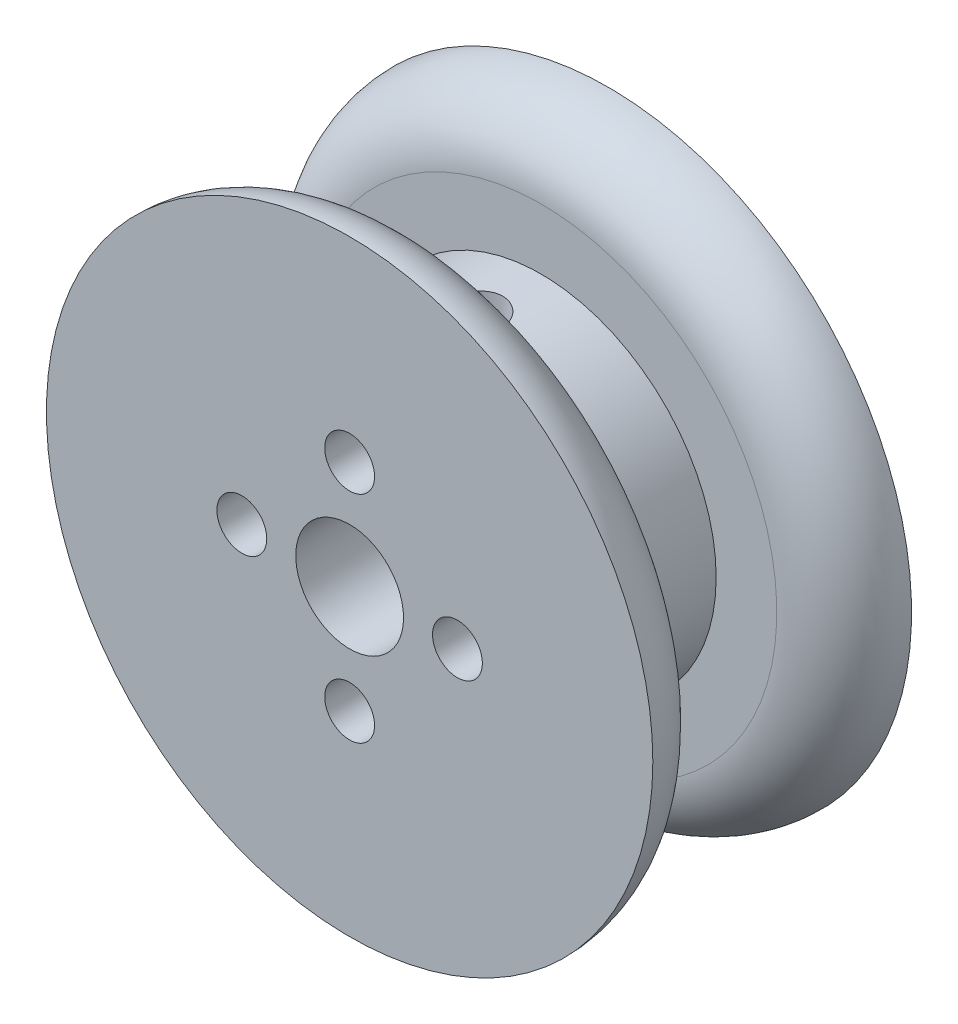
ISO-10303-21;
HEADER;
FILE_DESCRIPTION(('STEP AP214'),'2;1');
FILE_NAME('part.step','',(''),(''),'','','');
FILE_SCHEMA(('AUTOMOTIVE_DESIGN { 1 0 10303 214 1 1 1 1 }'));
ENDSEC;
DATA;
#1=APPLICATION_CONTEXT('core data for automotive mechanical design processes');
#2=APPLICATION_PROTOCOL_DEFINITION('international standard','automotive_design',2000,#1);
#3=PRODUCT_CONTEXT('',#1,'mechanical');
#4=PRODUCT('Part','Part','',(#3));
#5=PRODUCT_RELATED_PRODUCT_CATEGORY('part','',(#4));
#6=PRODUCT_DEFINITION_FORMATION('','',#4);
#7=PRODUCT_DEFINITION_CONTEXT('part definition',#1,'design');
#8=PRODUCT_DEFINITION('design','',#6,#7);
#9=PRODUCT_DEFINITION_SHAPE('','',#8);
#10=(LENGTH_UNIT() NAMED_UNIT(*) SI_UNIT(.MILLI.,.METRE.));
#11=(NAMED_UNIT(*) PLANE_ANGLE_UNIT() SI_UNIT($,.RADIAN.));
#12=(NAMED_UNIT(*) SI_UNIT($,.STERADIAN.) SOLID_ANGLE_UNIT());
#13=UNCERTAINTY_MEASURE_WITH_UNIT(LENGTH_MEASURE(1.E-05),#10,'distance_accuracy_value','');
#14=(GEOMETRIC_REPRESENTATION_CONTEXT(3) GLOBAL_UNCERTAINTY_ASSIGNED_CONTEXT((#13)) GLOBAL_UNIT_ASSIGNED_CONTEXT((#10,
#11,#12)) REPRESENTATION_CONTEXT('',''));
#15=CARTESIAN_POINT('',(0.,0.,0.));
#16=DIRECTION('',(0.,0.,1.));
#17=DIRECTION('',(1.,0.,0.));
#18=AXIS2_PLACEMENT_3D('',#15,#16,#17);
#19=CARTESIAN_POINT('',(0.,0.,-9.2));
#20=DIRECTION('',(0.,0.,1.));
#21=DIRECTION('',(1.,0.,0.));
#22=AXIS2_PLACEMENT_3D('',#19,#20,#21);
#23=CYLINDRICAL_SURFACE('',#22,13.);
#24=CARTESIAN_POINT('',(0.,-13.,-6.35));
#25=CARTESIAN_POINT('',(-0.103355224271389,-12.9999984046274,-6.34999569258269));
#26=CARTESIAN_POINT('',(-0.206771932129645,-12.998754476353,-6.34130944450442));
#27=CARTESIAN_POINT('',(-0.410718914534138,-12.9939118953438,-6.30680035180995));
#28=CARTESIAN_POINT('',(-0.511246207774866,-12.9903108956267,-6.28096042657621));
#29=CARTESIAN_POINT('',(-0.706432981710829,-12.9811591704458,-6.21292815236832));
#30=CARTESIAN_POINT('',(-0.801096681662608,-12.9756098665528,-6.17074772385023));
#31=CARTESIAN_POINT('',(-0.981986644509899,-12.9631760311847,-6.07125996451536));
#32=CARTESIAN_POINT('',(-1.06821416597394,-12.9562916993368,-6.01395489483037));
#33=CARTESIAN_POINT('',(-1.23040853191058,-12.9419000153636,-5.88541298593724));
#34=CARTESIAN_POINT('',(-1.30630718719231,-12.9343890055644,-5.8140905060376));
#35=CARTESIAN_POINT('',(-1.44510133911553,-12.9196194096118,-5.6597225672235));
#36=CARTESIAN_POINT('',(-1.50799611688199,-12.912360837432,-5.57667646063514));
#37=CARTESIAN_POINT('',(-1.61925905777618,-12.8988823569092,-5.40076513727148));
#38=CARTESIAN_POINT('',(-1.66756189810424,-12.8926671729623,-5.30785821086944));
#39=CARTESIAN_POINT('',(-1.74785247502596,-12.8820286482007,-5.11514729156198));
#40=CARTESIAN_POINT('',(-1.77984101151242,-12.8776052195382,-5.01534363707669));
#41=CARTESIAN_POINT('',(-1.8263845790242,-12.8710867266194,-4.8123866865606));
#42=CARTESIAN_POINT('',(-1.84105587566176,-12.868976141184,-4.70926056087973));
#43=CARTESIAN_POINT('',(-1.8529085459522,-12.8672750791784,-4.50199012423284));
#44=CARTESIAN_POINT('',(-1.85009082502002,-12.8676844721477,-4.39784586625472));
#45=CARTESIAN_POINT('',(-1.82714059605557,-12.8709629116664,-4.19231312051322));
#46=CARTESIAN_POINT('',(-1.80713711148445,-12.8738136292716,-4.0909098914198));
#47=CARTESIAN_POINT('',(-1.75058493681048,-12.8816249001714,-3.89291402781469));
#48=CARTESIAN_POINT('',(-1.714035821672,-12.886585507666,-3.79632151695482));
#49=CARTESIAN_POINT('',(-1.62529423001724,-12.8980780495524,-3.61029373882433));
#50=CARTESIAN_POINT('',(-1.57304664142565,-12.904615503508,-3.52088511683329));
#51=CARTESIAN_POINT('',(-1.45443052492482,-12.9185210606999,-3.35205540882575));
#52=CARTESIAN_POINT('',(-1.38806116167038,-12.9258892130622,-3.27263491407922));
#53=CARTESIAN_POINT('',(-1.24237501782575,-12.9407071171165,-3.12528777130375));
#54=CARTESIAN_POINT('',(-1.16294721335573,-12.9481570069325,-3.05747086136962));
#55=CARTESIAN_POINT('',(-0.993778506199191,-12.9622373199542,-2.93611363663936));
#56=CARTESIAN_POINT('',(-0.904037566132221,-12.9688677401896,-2.88257337359196));
#57=CARTESIAN_POINT('',(-0.716698313307467,-12.9805679993537,-2.79128543714122));
#58=CARTESIAN_POINT('',(-0.619096076962137,-12.9856370528363,-2.75354570878564));
#59=CARTESIAN_POINT('',(-0.418851174555621,-12.993636715029,-2.69502281880031));
#60=CARTESIAN_POINT('',(-0.316208815309098,-12.9965674537361,-2.67423862636513));
#61=CARTESIAN_POINT('',(-0.1097449840378,-12.9999431618151,-2.65036150932744));
#62=CARTESIAN_POINT('',(-0.00594130452324945,-13.0004093422212,-2.64711761989507));
#63=CARTESIAN_POINT('',(0.200728418740313,-12.9988609933125,-2.6580132376098));
#64=CARTESIAN_POINT('',(0.30359448845751,-12.9968465329135,-2.67215226183424));
#65=CARTESIAN_POINT('',(0.505015586085533,-12.9905763842772,-2.71728684856182));
#66=CARTESIAN_POINT('',(0.603587308770494,-12.9863304096685,-2.74820937258464));
#67=CARTESIAN_POINT('',(0.794146799332252,-12.9760720093274,-2.82595651538533));
#68=CARTESIAN_POINT('',(0.886134284961675,-12.9700595079255,-2.87278181537592));
#69=CARTESIAN_POINT('',(1.06158135313579,-12.9568840887436,-2.98136309360068));
#70=CARTESIAN_POINT('',(1.14498072656383,-12.9497138491383,-3.04321545409135));
#71=CARTESIAN_POINT('',(1.30026906989386,-12.9350452464949,-3.17996020270059));
#72=CARTESIAN_POINT('',(1.37215744056912,-12.9275468664008,-3.25485326925409));
#73=CARTESIAN_POINT('',(1.50292799609361,-12.913000421722,-3.41622330759965));
#74=CARTESIAN_POINT('',(1.56170934184532,-12.9059561262914,-3.50278238780377));
#75=CARTESIAN_POINT('',(1.66389774630913,-12.8931806601191,-3.6846341209078));
#76=CARTESIAN_POINT('',(1.70730518696191,-12.8874494567568,-3.77992655676706));
#77=CARTESIAN_POINT('',(1.77735502211296,-12.8779758877502,-3.97623127185951));
#78=CARTESIAN_POINT('',(1.80405171509974,-12.8742270868826,-4.07722385098156));
#79=CARTESIAN_POINT('',(1.84009576791879,-12.869125242328,-4.28231606268207));
#80=CARTESIAN_POINT('',(1.84944419639189,-12.8677720510735,-4.38641550347864));
#81=CARTESIAN_POINT('',(1.85050282189108,-12.8676197680126,-4.5937620199445));
#82=CARTESIAN_POINT('',(1.84237151885147,-12.8687977246238,-4.69700830475682));
#83=CARTESIAN_POINT('',(1.80903984516754,-12.8735253071112,-4.90064966659109));
#84=CARTESIAN_POINT('',(1.78383949140961,-12.8770749306411,-5.00104474643364));
#85=CARTESIAN_POINT('',(1.71713904046029,-12.88613817119,-5.19609740143244));
#86=CARTESIAN_POINT('',(1.67564891001854,-12.891650587101,-5.29075844410508));
#87=CARTESIAN_POINT('',(1.57756230416439,-12.9040199180505,-5.47180128423756));
#88=CARTESIAN_POINT('',(1.52096542108712,-12.9108768693706,-5.5581828581854));
#89=CARTESIAN_POINT('',(1.39369188288622,-12.9252368652281,-5.72102173909339));
#90=CARTESIAN_POINT('',(1.32289755317461,-12.9327449902197,-5.7973866338817));
#91=CARTESIAN_POINT('',(1.16948699317133,-12.9475181318469,-5.93721009565139));
#92=CARTESIAN_POINT('',(1.08686800768751,-12.9547830913358,-6.00066564633662));
#93=CARTESIAN_POINT('',(0.911677065314903,-12.9682919136744,-6.11314518363868));
#94=CARTESIAN_POINT('',(0.819058031069487,-12.9745305638802,-6.16209645193412));
#95=CARTESIAN_POINT('',(0.626870666287216,-12.9852323449838,-6.24367662304838));
#96=CARTESIAN_POINT('',(0.527309775880254,-12.9896973434759,-6.27632270404353));
#97=CARTESIAN_POINT('',(0.356065796509366,-12.9953107215786,-6.31682522588064));
#98=CARTESIAN_POINT('',(0.285447719902959,-12.9970603230679,-6.32924712968869));
#99=CARTESIAN_POINT('',(0.143229598916134,-12.9994055089737,-6.34583596547163));
#100=CARTESIAN_POINT('',(0.0716295649853334,-13.0000011056611,-6.35000298522334));
#101=CARTESIAN_POINT('',(0.,-13.,-6.35));
#102=B_SPLINE_CURVE_WITH_KNOTS('',3,(#24,#25,#26,#27,#28,#29,#30,#31,#32,#33,#34,#35,#36,#37,
#38,#39,#40,#41,#42,#43,#44,#45,#46,#47,#48,#49,#50,#51,#52,#53,#54,#55,#56,#57,#58,#59,#60,#61,
#62,#63,#64,#65,#66,#67,#68,#69,#70,#71,#72,#73,#74,#75,#76,#77,#78,#79,#80,#81,#82,#83,#84,#85,
#86,#87,#88,#89,#90,#91,#92,#93,#94,#95,#96,#97,#98,#99,#100,#101),.UNSPECIFIED.,.T.,.F.,(4,2,2,
2,2,2,2,2,2,2,2,2,2,2,2,2,2,2,2,2,2,2,2,2,2,2,2,2,2,2,2,2,2,2,2,2,2,2,4),(0.,0.309803964847356,
0.619916877811146,0.929803987008506,1.23964479434159,1.55144099954288,1.86325443672845,
2.17644374122449,2.48961768852473,2.80067684725193,3.11171990242956,3.42044798235276,
3.72918399354696,4.03901679530543,4.34886792969821,4.66150437737796,4.97414195825925,
5.28693655571911,5.59971213553144,5.90979140112807,6.21986205246585,6.52859403195998,
6.83733923799311,7.14811956286881,7.45891606073841,7.77202695547842,8.08513007092096,
8.39721046118444,8.70927162687812,9.01851507703499,9.32775822125848,9.63681245203345,
9.94587502366722,10.2576138006398,10.5694253326066,10.8827746841559,11.1957932093905,
11.4105028126858,11.6252101328932),.UNSPECIFIED.);
#103=CARTESIAN_POINT('',(0.,-13.,-6.35));
#104=VERTEX_POINT('',#103);
#105=EDGE_CURVE('E130',#104,#104,#102,.T.);
#106=ORIENTED_EDGE('',*,*,#105,.T.);
#107=EDGE_LOOP('',(#106));
#108=FACE_BOUND('',#107,.T.);
#109=CARTESIAN_POINT('',(0.,0.,-9.2));
#110=DIRECTION('',(0.,0.,1.));
#111=DIRECTION('',(1.,0.,0.));
#112=AXIS2_PLACEMENT_3D('',#109,#110,#111);
#113=CIRCLE('',#112,13.);
#114=CARTESIAN_POINT('',(13.,0.,-9.2));
#115=VERTEX_POINT('',#114);
#116=EDGE_CURVE('E87',#115,#115,#113,.T.);
#117=ORIENTED_EDGE('',*,*,#116,.T.);
#118=EDGE_LOOP('',(#117));
#119=FACE_BOUND('',#118,.T.);
#120=CARTESIAN_POINT('',(0.,0.,0.));
#121=DIRECTION('',(0.,0.,1.));
#122=DIRECTION('',(1.,0.,0.));
#123=AXIS2_PLACEMENT_3D('',#120,#121,#122);
#124=CIRCLE('',#123,13.);
#125=CARTESIAN_POINT('',(13.,0.,0.));
#126=VERTEX_POINT('',#125);
#127=EDGE_CURVE('E84',#126,#126,#124,.T.);
#128=ORIENTED_EDGE('',*,*,#127,.F.);
#129=EDGE_LOOP('',(#128));
#130=FACE_BOUND('',#129,.T.);
#131=CARTESIAN_POINT('',(0.,13.,-6.35));
#132=CARTESIAN_POINT('',(0.103355224271389,12.9999984046274,-6.34999569258269));
#133=CARTESIAN_POINT('',(0.206771932129645,12.998754476353,-6.34130944450442));
#134=CARTESIAN_POINT('',(0.410718914534138,12.9939118953438,-6.30680035180995));
#135=CARTESIAN_POINT('',(0.511246207774866,12.9903108956267,-6.28096042657621));
#136=CARTESIAN_POINT('',(0.706432981710829,12.9811591704458,-6.21292815236832));
#137=CARTESIAN_POINT('',(0.801096681662608,12.9756098665528,-6.17074772385023));
#138=CARTESIAN_POINT('',(0.981986644509899,12.9631760311847,-6.07125996451536));
#139=CARTESIAN_POINT('',(1.06821416597394,12.9562916993368,-6.01395489483037));
#140=CARTESIAN_POINT('',(1.23040853191058,12.9419000153636,-5.88541298593724));
#141=CARTESIAN_POINT('',(1.30630718719231,12.9343890055644,-5.8140905060376));
#142=CARTESIAN_POINT('',(1.44510133911553,12.9196194096118,-5.6597225672235));
#143=CARTESIAN_POINT('',(1.50799611688199,12.912360837432,-5.57667646063514));
#144=CARTESIAN_POINT('',(1.61925905777618,12.8988823569092,-5.40076513727148));
#145=CARTESIAN_POINT('',(1.66756189810424,12.8926671729623,-5.30785821086944));
#146=CARTESIAN_POINT('',(1.74785247502596,12.8820286482007,-5.11514729156198));
#147=CARTESIAN_POINT('',(1.77984101151242,12.8776052195382,-5.01534363707669));
#148=CARTESIAN_POINT('',(1.8263845790242,12.8710867266194,-4.8123866865606));
#149=CARTESIAN_POINT('',(1.84105587566176,12.868976141184,-4.70926056087973));
#150=CARTESIAN_POINT('',(1.8529085459522,12.8672750791784,-4.50199012423284));
#151=CARTESIAN_POINT('',(1.85009082502002,12.8676844721477,-4.39784586625472));
#152=CARTESIAN_POINT('',(1.82714059605557,12.8709629116664,-4.19231312051322));
#153=CARTESIAN_POINT('',(1.80713711148445,12.8738136292716,-4.0909098914198));
#154=CARTESIAN_POINT('',(1.75058493681048,12.8816249001714,-3.89291402781469));
#155=CARTESIAN_POINT('',(1.714035821672,12.886585507666,-3.79632151695482));
#156=CARTESIAN_POINT('',(1.62529423001724,12.8980780495524,-3.61029373882433));
#157=CARTESIAN_POINT('',(1.57304664142565,12.904615503508,-3.52088511683329));
#158=CARTESIAN_POINT('',(1.45443052492482,12.9185210606999,-3.35205540882575));
#159=CARTESIAN_POINT('',(1.38806116167038,12.9258892130622,-3.27263491407922));
#160=CARTESIAN_POINT('',(1.24237501782575,12.9407071171165,-3.12528777130375));
#161=CARTESIAN_POINT('',(1.16294721335573,12.9481570069325,-3.05747086136962));
#162=CARTESIAN_POINT('',(0.993778506199191,12.9622373199542,-2.93611363663936));
#163=CARTESIAN_POINT('',(0.904037566132221,12.9688677401896,-2.88257337359196));
#164=CARTESIAN_POINT('',(0.716698313307467,12.9805679993537,-2.79128543714122));
#165=CARTESIAN_POINT('',(0.619096076962137,12.9856370528363,-2.75354570878564));
#166=CARTESIAN_POINT('',(0.418851174555621,12.993636715029,-2.69502281880031));
#167=CARTESIAN_POINT('',(0.316208815309098,12.9965674537361,-2.67423862636513));
#168=CARTESIAN_POINT('',(0.1097449840378,12.9999431618151,-2.65036150932744));
#169=CARTESIAN_POINT('',(0.00594130452324945,13.0004093422212,-2.64711761989507));
#170=CARTESIAN_POINT('',(-0.200728418740313,12.9988609933125,-2.6580132376098));
#171=CARTESIAN_POINT('',(-0.30359448845751,12.9968465329135,-2.67215226183424));
#172=CARTESIAN_POINT('',(-0.505015586085533,12.9905763842772,-2.71728684856182));
#173=CARTESIAN_POINT('',(-0.603587308770494,12.9863304096685,-2.74820937258464));
#174=CARTESIAN_POINT('',(-0.794146799332252,12.9760720093274,-2.82595651538533));
#175=CARTESIAN_POINT('',(-0.886134284961675,12.9700595079255,-2.87278181537592));
#176=CARTESIAN_POINT('',(-1.06158135313579,12.9568840887436,-2.98136309360068));
#177=CARTESIAN_POINT('',(-1.14498072656383,12.9497138491383,-3.04321545409135));
#178=CARTESIAN_POINT('',(-1.30026906989386,12.9350452464949,-3.17996020270059));
#179=CARTESIAN_POINT('',(-1.37215744056912,12.9275468664008,-3.25485326925409));
#180=CARTESIAN_POINT('',(-1.50292799609361,12.913000421722,-3.41622330759965));
#181=CARTESIAN_POINT('',(-1.56170934184532,12.9059561262914,-3.50278238780377));
#182=CARTESIAN_POINT('',(-1.66389774630913,12.8931806601191,-3.6846341209078));
#183=CARTESIAN_POINT('',(-1.70730518696191,12.8874494567568,-3.77992655676706));
#184=CARTESIAN_POINT('',(-1.77735502211296,12.8779758877502,-3.97623127185951));
#185=CARTESIAN_POINT('',(-1.80405171509974,12.8742270868826,-4.07722385098156));
#186=CARTESIAN_POINT('',(-1.84009576791879,12.869125242328,-4.28231606268207));
#187=CARTESIAN_POINT('',(-1.84944419639189,12.8677720510735,-4.38641550347864));
#188=CARTESIAN_POINT('',(-1.85050282189108,12.8676197680126,-4.5937620199445));
#189=CARTESIAN_POINT('',(-1.84237151885147,12.8687977246238,-4.69700830475682));
#190=CARTESIAN_POINT('',(-1.80903984516754,12.8735253071112,-4.90064966659109));
#191=CARTESIAN_POINT('',(-1.78383949140961,12.8770749306411,-5.00104474643364));
#192=CARTESIAN_POINT('',(-1.71713904046029,12.88613817119,-5.19609740143244));
#193=CARTESIAN_POINT('',(-1.67564891001854,12.891650587101,-5.29075844410508));
#194=CARTESIAN_POINT('',(-1.57756230416439,12.9040199180505,-5.47180128423756));
#195=CARTESIAN_POINT('',(-1.52096542108712,12.9108768693706,-5.5581828581854));
#196=CARTESIAN_POINT('',(-1.39369188288622,12.9252368652281,-5.72102173909339));
#197=CARTESIAN_POINT('',(-1.32289755317461,12.9327449902197,-5.7973866338817));
#198=CARTESIAN_POINT('',(-1.16948699317133,12.9475181318469,-5.93721009565139));
#199=CARTESIAN_POINT('',(-1.08686800768751,12.9547830913358,-6.00066564633662));
#200=CARTESIAN_POINT('',(-0.911677065314903,12.9682919136744,-6.11314518363868));
#201=CARTESIAN_POINT('',(-0.819058031069487,12.9745305638802,-6.16209645193412));
#202=CARTESIAN_POINT('',(-0.626870666287216,12.9852323449838,-6.24367662304838));
#203=CARTESIAN_POINT('',(-0.527309775880254,12.9896973434759,-6.27632270404353));
#204=CARTESIAN_POINT('',(-0.356065796509366,12.9953107215786,-6.31682522588064));
#205=CARTESIAN_POINT('',(-0.285447719902959,12.9970603230679,-6.32924712968869));
#206=CARTESIAN_POINT('',(-0.143229598916134,12.9994055089737,-6.34583596547163));
#207=CARTESIAN_POINT('',(-0.0716295649853334,13.0000011056611,-6.35000298522334));
#208=CARTESIAN_POINT('',(0.,13.,-6.35));
#209=B_SPLINE_CURVE_WITH_KNOTS('',3,(#131,#132,#133,#134,#135,#136,#137,#138,#139,#140,#141,
#142,#143,#144,#145,#146,#147,#148,#149,#150,#151,#152,#153,#154,#155,#156,#157,#158,#159,#160,
#161,#162,#163,#164,#165,#166,#167,#168,#169,#170,#171,#172,#173,#174,#175,#176,#177,#178,#179,
#180,#181,#182,#183,#184,#185,#186,#187,#188,#189,#190,#191,#192,#193,#194,#195,#196,#197,#198,
#199,#200,#201,#202,#203,#204,#205,#206,#207,#208),.UNSPECIFIED.,.T.,.F.,(4,2,2,2,2,2,2,2,2,2,2,
2,2,2,2,2,2,2,2,2,2,2,2,2,2,2,2,2,2,2,2,2,2,2,2,2,2,2,4),(0.,0.309803964847356,
0.619916877811146,0.929803987008506,1.23964479434159,1.55144099954288,1.86325443672845,
2.17644374122449,2.48961768852473,2.80067684725193,3.11171990242956,3.42044798235276,
3.72918399354696,4.03901679530543,4.34886792969821,4.66150437737796,4.97414195825925,
5.28693655571911,5.59971213553144,5.90979140112807,6.21986205246585,6.52859403195998,
6.83733923799311,7.14811956286881,7.45891606073841,7.77202695547842,8.08513007092096,
8.39721046118444,8.70927162687812,9.01851507703499,9.32775822125848,9.63681245203345,
9.94587502366722,10.2576138006398,10.5694253326066,10.8827746841559,11.1957932093905,
11.4105028126858,11.6252101328932),.UNSPECIFIED.);
#210=CARTESIAN_POINT('',(0.,13.,-6.35));
#211=VERTEX_POINT('',#210);
#212=EDGE_CURVE('E116',#211,#211,#209,.T.);
#213=ORIENTED_EDGE('',*,*,#212,.T.);
#214=EDGE_LOOP('',(#213));
#215=FACE_BOUND('',#214,.T.);
#216=ADVANCED_FACE('F33',(#108,#119,#130,#215),#23,.T.);
#217=CARTESIAN_POINT('',(0.,0.,-14.2));
#218=DIRECTION('',(0.,0.,1.));
#219=DIRECTION('',(1.,0.,0.));
#220=AXIS2_PLACEMENT_3D('',#217,#218,#219);
#221=CYLINDRICAL_SURFACE('',#220,4.);
#222=CARTESIAN_POINT('',(0.,0.,-14.2));
#223=DIRECTION('',(0.,0.,1.));
#224=DIRECTION('',(1.,0.,0.));
#225=AXIS2_PLACEMENT_3D('',#222,#223,#224);
#226=CIRCLE('',#225,4.);
#227=CARTESIAN_POINT('',(4.,0.,-14.2));
#228=VERTEX_POINT('',#227);
#229=EDGE_CURVE('E93',#228,#228,#226,.T.);
#230=ORIENTED_EDGE('',*,*,#229,.F.);
#231=EDGE_LOOP('',(#230));
#232=FACE_BOUND('',#231,.T.);
#233=CARTESIAN_POINT('',(0.,0.,5.));
#234=DIRECTION('',(0.,0.,1.));
#235=DIRECTION('',(1.,0.,0.));
#236=AXIS2_PLACEMENT_3D('',#233,#234,#235);
#237=CIRCLE('',#236,4.);
#238=CARTESIAN_POINT('',(4.,0.,5.));
#239=VERTEX_POINT('',#238);
#240=EDGE_CURVE('E94',#239,#239,#237,.T.);
#241=ORIENTED_EDGE('',*,*,#240,.T.);
#242=EDGE_LOOP('',(#241));
#243=FACE_BOUND('',#242,.T.);
#244=CARTESIAN_POINT('',(0.,-4.,-6.35));
#245=CARTESIAN_POINT('',(-0.0981107959034547,-3.99999563185025,-6.34999477443588));
#246=CARTESIAN_POINT('',(-0.196363688434596,-3.99635048598771,-6.34214936993113));
#247=CARTESIAN_POINT('',(-0.390018987436305,-3.98213029308312,-6.31108967327009));
#248=CARTESIAN_POINT('',(-0.485414468239557,-3.97153964142197,-6.28784077253315));
#249=CARTESIAN_POINT('',(-0.670249435356517,-3.94454784250849,-6.22704771573347));
#250=CARTESIAN_POINT('',(-0.759709422427625,-3.92816808080318,-6.18955613588384));
#251=CARTESIAN_POINT('',(-0.930961849433421,-3.89114331131756,-6.10158814039927));
#252=CARTESIAN_POINT('',(-1.01275565782961,-3.87049906689055,-6.05111404827131));
#253=CARTESIAN_POINT('',(-1.17132677493027,-3.82559103176908,-5.93549113826206));
#254=CARTESIAN_POINT('',(-1.24759496448728,-3.80119201256394,-5.86969725587062));
#255=CARTESIAN_POINT('',(-1.38847033111933,-3.75202980143627,-5.72667709466708));
#256=CARTESIAN_POINT('',(-1.45306997223898,-3.72726638525755,-5.64944348585874));
#257=CARTESIAN_POINT('',(-1.57287944355213,-3.67838325934363,-5.4797983125481));
#258=CARTESIAN_POINT('',(-1.62722775452371,-3.65440530830341,-5.38673292016321));
#259=CARTESIAN_POINT('',(-1.71927526481678,-3.61201867578808,-5.19153117807151));
#260=CARTESIAN_POINT('',(-1.75698492420497,-3.59360649762963,-5.08940057595862));
#261=CARTESIAN_POINT('',(-1.8124666315105,-3.5659338012212,-4.88479269108667));
#262=CARTESIAN_POINT('',(-1.8312252974022,-3.5562237786447,-4.78264645233343));
#263=CARTESIAN_POINT('',(-1.85132907441692,-3.54580362742021,-4.57623141850744));
#264=CARTESIAN_POINT('',(-1.85268737129984,-3.54508668394936,-4.47196429063726));
#265=CARTESIAN_POINT('',(-1.83868333156047,-3.55236265971843,-4.27528399763574));
#266=CARTESIAN_POINT('',(-1.82495669552359,-3.5595036256481,-4.18271584571675));
#267=CARTESIAN_POINT('',(-1.78396401935014,-3.5802226502371,-4.0013850946305));
#268=CARTESIAN_POINT('',(-1.75669458775748,-3.59380232127128,-3.9126234547612));
#269=CARTESIAN_POINT('',(-1.68885422691997,-3.62618338690352,-3.73897077277065));
#270=CARTESIAN_POINT('',(-1.6479921460867,-3.64509756114176,-3.65421547348688));
#271=CARTESIAN_POINT('',(-1.55433916408806,-3.68600564210517,-3.49238921331345));
#272=CARTESIAN_POINT('',(-1.50154308071812,-3.70800088516671,-3.41532161173579));
#273=CARTESIAN_POINT('',(-1.37894824540674,-3.75543077513567,-3.26242362665562));
#274=CARTESIAN_POINT('',(-1.30793797329122,-3.78098233750284,-3.18759778631761));
#275=CARTESIAN_POINT('',(-1.15419368475693,-3.83071311749638,-3.05053550792609));
#276=CARTESIAN_POINT('',(-1.0714555424302,-3.8548918479448,-2.98830351922122));
#277=CARTESIAN_POINT('',(-0.892942404849179,-3.90018065395486,-2.87622956142585));
#278=CARTESIAN_POINT('',(-0.796816765442289,-3.92115650059806,-2.82688764578923));
#279=CARTESIAN_POINT('',(-0.596409943532538,-3.95659186929408,-2.74544268455946));
#280=CARTESIAN_POINT('',(-0.492134385351668,-3.97105583944888,-2.71332786867998));
#281=CARTESIAN_POINT('',(-0.286697906890673,-3.9909465880091,-2.66956204714751));
#282=CARTESIAN_POINT('',(-0.18588043856406,-3.9969645458649,-2.65656886248771));
#283=CARTESIAN_POINT('',(0.0166689561930181,-4.00124572175528,-2.64730242197993));
#284=CARTESIAN_POINT('',(0.118400521901187,-3.99951187532143,-2.65102283685979));
#285=CARTESIAN_POINT('',(0.31299265770669,-3.98885084653179,-2.67420635481435));
#286=CARTESIAN_POINT('',(0.406004079066732,-3.98039149633433,-2.69264590656832));
#287=CARTESIAN_POINT('',(0.587465774883243,-3.95768242944697,-2.74322479580521));
#288=CARTESIAN_POINT('',(0.675915510128223,-3.94343202998917,-2.77536574871279));
#289=CARTESIAN_POINT('',(0.848852895673931,-3.90991686245813,-2.85341936179598));
#290=CARTESIAN_POINT('',(0.933134641875909,-3.89051118574861,-2.89972565641037));
#291=CARTESIAN_POINT('',(1.09303169879694,-3.84865220377197,-3.00436575839978));
#292=CARTESIAN_POINT('',(1.16864317822956,-3.82619756070266,-3.06270485129881));
#293=CARTESIAN_POINT('',(1.31596011744917,-3.7781950952715,-3.19561430326224));
#294=CARTESIAN_POINT('',(1.3867624322798,-3.75254770228186,-3.2711519893562));
#295=CARTESIAN_POINT('',(1.5150234323549,-3.70262760216837,-3.43327862590354));
#296=CARTESIAN_POINT('',(1.57247607224409,-3.67835552159753,-3.51987255574313));
#297=CARTESIAN_POINT('',(1.67397347707339,-3.63331793497476,-3.70514153691298));
#298=CARTESIAN_POINT('',(1.71755340044744,-3.61268268294912,-3.80410549348183));
#299=CARTESIAN_POINT('',(1.78699247446121,-3.57885110012029,-4.00923605939258));
#300=CARTESIAN_POINT('',(1.81287080765982,-3.56564671951731,-4.11539473448175));
#301=CARTESIAN_POINT('',(1.84407486211769,-3.54960106485084,-4.32171757976316));
#302=CARTESIAN_POINT('',(1.85102808714541,-3.54594040621881,-4.42157169971829));
#303=CARTESIAN_POINT('',(1.84872667464058,-3.54714176593039,-4.62102767496199));
#304=CARTESIAN_POINT('',(1.83947635650825,-3.55200151297834,-4.72062959039335));
#305=CARTESIAN_POINT('',(1.80648943847128,-3.56887890739915,-4.90943401015708));
#306=CARTESIAN_POINT('',(1.78381823682772,-3.58036869298869,-4.99887505471529));
#307=CARTESIAN_POINT('',(1.72581618780541,-3.60868313623598,-5.17264797476455));
#308=CARTESIAN_POINT('',(1.6904815938778,-3.62550937254848,-5.25697832958256));
#309=CARTESIAN_POINT('',(1.60550609627545,-3.66396749272462,-5.42424186290208));
#310=CARTESIAN_POINT('',(1.55507571476328,-3.68584303408746,-5.5067165507351));
#311=CARTESIAN_POINT('',(1.44231464725551,-3.73141056920351,-5.6625347083086));
#312=CARTESIAN_POINT('',(1.37997850684741,-3.75510339252352,-5.73587396727133));
#313=CARTESIAN_POINT('',(1.23798285524782,-3.80441549804232,-5.87877052499519));
#314=CARTESIAN_POINT('',(1.15722504008795,-3.82999640416911,-5.94725536094267));
#315=CARTESIAN_POINT('',(0.984514135898264,-3.87798344158914,-6.06985472932552));
#316=CARTESIAN_POINT('',(0.892555805352113,-3.90038807578443,-6.12396249573535));
#317=CARTESIAN_POINT('',(0.700333031614679,-3.93942732926897,-6.21560418612795));
#318=CARTESIAN_POINT('',(0.600127331504284,-3.95609900699617,-6.25324500230248));
#319=CARTESIAN_POINT('',(0.393979579697905,-3.98189518981401,-6.31070670568111));
#320=CARTESIAN_POINT('',(0.288055701218961,-3.9910422595846,-6.33058088685885));
#321=CARTESIAN_POINT('',(0.151109584758197,-3.99725987467202,-6.34406820630408));
#322=CARTESIAN_POINT('',(0.12094386866088,-3.99828542355725,-6.34629028011606));
#323=CARTESIAN_POINT('',(0.0605232777124432,-3.99965616630067,-6.34925699664494));
#324=CARTESIAN_POINT('',(0.0302684012295368,-4.00000134762855,-6.35000161215155));
#325=CARTESIAN_POINT('',(0.,-4.,-6.35));
#326=B_SPLINE_CURVE_WITH_KNOTS('',3,(#244,#245,#246,#247,#248,#249,#250,#251,#252,#253,#254,
#255,#256,#257,#258,#259,#260,#261,#262,#263,#264,#265,#266,#267,#268,#269,#270,#271,#272,#273,
#274,#275,#276,#277,#278,#279,#280,#281,#282,#283,#284,#285,#286,#287,#288,#289,#290,#291,#292,
#293,#294,#295,#296,#297,#298,#299,#300,#301,#302,#303,#304,#305,#306,#307,#308,#309,#310,#311,
#312,#313,#314,#315,#316,#317,#318,#319,#320,#321,#322,#323,#324,#325),.UNSPECIFIED.,.T.,.F.,(4,
2,2,2,2,2,2,2,2,2,2,2,2,2,2,2,2,2,2,2,2,2,2,2,2,2,2,2,2,2,2,2,2,2,2,2,2,2,2,2,4),(0.,
0.294208547197163,0.589080374129943,0.882874108750818,1.17661529904386,1.4862125197966,
1.79600897983553,2.12556167406251,2.45490689524043,2.76605211669358,3.07696154262486,
3.35721054786529,3.63752976990999,3.92428802009183,4.21117103180867,4.52858529074742,
4.84611149562721,5.17456429543389,5.50279239557327,5.80665390734146,6.11040035951098,
6.39469242256052,6.67901801353036,6.97209977294988,7.26531054661609,7.58387594306873,
7.90258532085244,8.2310615954014,8.55918134602518,8.85803043951555,9.15679988052528,
9.43454128983158,9.7123649387084,10.0085012966213,10.3047736510087,10.6300395600271,
10.9554582731449,11.2787320590524,11.6010328456764,11.6917981714196,11.782565168769),.UNSPECIFIED.);
#327=CARTESIAN_POINT('',(0.,-4.,-6.35));
#328=VERTEX_POINT('',#327);
#329=EDGE_CURVE('E146',#328,#328,#326,.T.);
#330=ORIENTED_EDGE('',*,*,#329,.F.);
#331=EDGE_LOOP('',(#330));
#332=FACE_BOUND('',#331,.T.);
#333=CARTESIAN_POINT('',(0.,4.,-6.35));
#334=CARTESIAN_POINT('',(0.0981107959034547,3.99999563185025,-6.34999477443588));
#335=CARTESIAN_POINT('',(0.196363688434596,3.99635048598771,-6.34214936993113));
#336=CARTESIAN_POINT('',(0.390018987436305,3.98213029308312,-6.31108967327009));
#337=CARTESIAN_POINT('',(0.485414468239557,3.97153964142197,-6.28784077253315));
#338=CARTESIAN_POINT('',(0.670249435356517,3.94454784250849,-6.22704771573347));
#339=CARTESIAN_POINT('',(0.759709422427625,3.92816808080318,-6.18955613588384));
#340=CARTESIAN_POINT('',(0.930961849433421,3.89114331131756,-6.10158814039927));
#341=CARTESIAN_POINT('',(1.01275565782961,3.87049906689055,-6.05111404827131));
#342=CARTESIAN_POINT('',(1.17132677493027,3.82559103176908,-5.93549113826206));
#343=CARTESIAN_POINT('',(1.24759496448728,3.80119201256394,-5.86969725587062));
#344=CARTESIAN_POINT('',(1.38847033111933,3.75202980143627,-5.72667709466708));
#345=CARTESIAN_POINT('',(1.45306997223898,3.72726638525755,-5.64944348585874));
#346=CARTESIAN_POINT('',(1.57287944355213,3.67838325934363,-5.4797983125481));
#347=CARTESIAN_POINT('',(1.62722775452371,3.65440530830341,-5.38673292016321));
#348=CARTESIAN_POINT('',(1.71927526481678,3.61201867578808,-5.19153117807151));
#349=CARTESIAN_POINT('',(1.75698492420497,3.59360649762963,-5.08940057595862));
#350=CARTESIAN_POINT('',(1.8124666315105,3.5659338012212,-4.88479269108667));
#351=CARTESIAN_POINT('',(1.8312252974022,3.5562237786447,-4.78264645233343));
#352=CARTESIAN_POINT('',(1.85132907441692,3.54580362742021,-4.57623141850744));
#353=CARTESIAN_POINT('',(1.85268737129984,3.54508668394936,-4.47196429063726));
#354=CARTESIAN_POINT('',(1.83868333156047,3.55236265971843,-4.27528399763574));
#355=CARTESIAN_POINT('',(1.82495669552359,3.5595036256481,-4.18271584571675));
#356=CARTESIAN_POINT('',(1.78396401935014,3.5802226502371,-4.0013850946305));
#357=CARTESIAN_POINT('',(1.75669458775748,3.59380232127128,-3.9126234547612));
#358=CARTESIAN_POINT('',(1.68885422691997,3.62618338690352,-3.73897077277065));
#359=CARTESIAN_POINT('',(1.6479921460867,3.64509756114176,-3.65421547348688));
#360=CARTESIAN_POINT('',(1.55433916408806,3.68600564210517,-3.49238921331345));
#361=CARTESIAN_POINT('',(1.50154308071812,3.70800088516671,-3.41532161173579));
#362=CARTESIAN_POINT('',(1.37894824540674,3.75543077513567,-3.26242362665562));
#363=CARTESIAN_POINT('',(1.30793797329122,3.78098233750284,-3.18759778631761));
#364=CARTESIAN_POINT('',(1.15419368475693,3.83071311749638,-3.05053550792609));
#365=CARTESIAN_POINT('',(1.0714555424302,3.8548918479448,-2.98830351922122));
#366=CARTESIAN_POINT('',(0.892942404849179,3.90018065395486,-2.87622956142585));
#367=CARTESIAN_POINT('',(0.796816765442289,3.92115650059806,-2.82688764578923));
#368=CARTESIAN_POINT('',(0.596409943532538,3.95659186929408,-2.74544268455946));
#369=CARTESIAN_POINT('',(0.492134385351668,3.97105583944888,-2.71332786867998));
#370=CARTESIAN_POINT('',(0.286697906890673,3.9909465880091,-2.66956204714751));
#371=CARTESIAN_POINT('',(0.18588043856406,3.9969645458649,-2.65656886248771));
#372=CARTESIAN_POINT('',(-0.0166689561930181,4.00124572175528,-2.64730242197993));
#373=CARTESIAN_POINT('',(-0.118400521901187,3.99951187532143,-2.65102283685979));
#374=CARTESIAN_POINT('',(-0.31299265770669,3.98885084653179,-2.67420635481435));
#375=CARTESIAN_POINT('',(-0.406004079066732,3.98039149633433,-2.69264590656832));
#376=CARTESIAN_POINT('',(-0.587465774883243,3.95768242944697,-2.74322479580521));
#377=CARTESIAN_POINT('',(-0.675915510128223,3.94343202998917,-2.77536574871279));
#378=CARTESIAN_POINT('',(-0.848852895673931,3.90991686245813,-2.85341936179598));
#379=CARTESIAN_POINT('',(-0.933134641875909,3.89051118574861,-2.89972565641037));
#380=CARTESIAN_POINT('',(-1.09303169879694,3.84865220377197,-3.00436575839978));
#381=CARTESIAN_POINT('',(-1.16864317822956,3.82619756070266,-3.06270485129881));
#382=CARTESIAN_POINT('',(-1.31596011744917,3.7781950952715,-3.19561430326224));
#383=CARTESIAN_POINT('',(-1.3867624322798,3.75254770228186,-3.2711519893562));
#384=CARTESIAN_POINT('',(-1.5150234323549,3.70262760216837,-3.43327862590354));
#385=CARTESIAN_POINT('',(-1.57247607224409,3.67835552159753,-3.51987255574313));
#386=CARTESIAN_POINT('',(-1.67397347707339,3.63331793497476,-3.70514153691298));
#387=CARTESIAN_POINT('',(-1.71755340044744,3.61268268294912,-3.80410549348183));
#388=CARTESIAN_POINT('',(-1.78699247446121,3.57885110012029,-4.00923605939258));
#389=CARTESIAN_POINT('',(-1.81287080765982,3.56564671951731,-4.11539473448175));
#390=CARTESIAN_POINT('',(-1.84407486211769,3.54960106485084,-4.32171757976316));
#391=CARTESIAN_POINT('',(-1.85102808714541,3.54594040621881,-4.42157169971829));
#392=CARTESIAN_POINT('',(-1.84872667464058,3.54714176593039,-4.62102767496199));
#393=CARTESIAN_POINT('',(-1.83947635650825,3.55200151297834,-4.72062959039335));
#394=CARTESIAN_POINT('',(-1.80648943847128,3.56887890739915,-4.90943401015708));
#395=CARTESIAN_POINT('',(-1.78381823682772,3.58036869298869,-4.99887505471529));
#396=CARTESIAN_POINT('',(-1.72581618780541,3.60868313623598,-5.17264797476455));
#397=CARTESIAN_POINT('',(-1.6904815938778,3.62550937254848,-5.25697832958256));
#398=CARTESIAN_POINT('',(-1.60550609627545,3.66396749272462,-5.42424186290208));
#399=CARTESIAN_POINT('',(-1.55507571476328,3.68584303408746,-5.5067165507351));
#400=CARTESIAN_POINT('',(-1.44231464725551,3.73141056920351,-5.6625347083086));
#401=CARTESIAN_POINT('',(-1.37997850684741,3.75510339252352,-5.73587396727133));
#402=CARTESIAN_POINT('',(-1.23798285524782,3.80441549804232,-5.87877052499519));
#403=CARTESIAN_POINT('',(-1.15722504008795,3.82999640416911,-5.94725536094267));
#404=CARTESIAN_POINT('',(-0.984514135898264,3.87798344158914,-6.06985472932552));
#405=CARTESIAN_POINT('',(-0.892555805352113,3.90038807578443,-6.12396249573535));
#406=CARTESIAN_POINT('',(-0.700333031614679,3.93942732926897,-6.21560418612795));
#407=CARTESIAN_POINT('',(-0.600127331504284,3.95609900699617,-6.25324500230248));
#408=CARTESIAN_POINT('',(-0.393979579697905,3.98189518981401,-6.31070670568111));
#409=CARTESIAN_POINT('',(-0.288055701218961,3.9910422595846,-6.33058088685885));
#410=CARTESIAN_POINT('',(-0.151109584758197,3.99725987467202,-6.34406820630408));
#411=CARTESIAN_POINT('',(-0.12094386866088,3.99828542355725,-6.34629028011606));
#412=CARTESIAN_POINT('',(-0.0605232777124432,3.99965616630067,-6.34925699664494));
#413=CARTESIAN_POINT('',(-0.0302684012295368,4.00000134762855,-6.35000161215155));
#414=CARTESIAN_POINT('',(0.,4.,-6.35));
#415=B_SPLINE_CURVE_WITH_KNOTS('',3,(#333,#334,#335,#336,#337,#338,#339,#340,#341,#342,#343,
#344,#345,#346,#347,#348,#349,#350,#351,#352,#353,#354,#355,#356,#357,#358,#359,#360,#361,#362,
#363,#364,#365,#366,#367,#368,#369,#370,#371,#372,#373,#374,#375,#376,#377,#378,#379,#380,#381,
#382,#383,#384,#385,#386,#387,#388,#389,#390,#391,#392,#393,#394,#395,#396,#397,#398,#399,#400,
#401,#402,#403,#404,#405,#406,#407,#408,#409,#410,#411,#412,#413,#414),.UNSPECIFIED.,.T.,.F.,(4,
2,2,2,2,2,2,2,2,2,2,2,2,2,2,2,2,2,2,2,2,2,2,2,2,2,2,2,2,2,2,2,2,2,2,2,2,2,2,2,4),(0.,
0.294208547197163,0.589080374129943,0.882874108750818,1.17661529904386,1.4862125197966,
1.79600897983553,2.12556167406251,2.45490689524043,2.76605211669358,3.07696154262486,
3.35721054786529,3.63752976990999,3.92428802009183,4.21117103180867,4.52858529074742,
4.84611149562721,5.17456429543389,5.50279239557327,5.80665390734146,6.11040035951098,
6.39469242256052,6.67901801353036,6.97209977294988,7.26531054661609,7.58387594306873,
7.90258532085244,8.2310615954014,8.55918134602518,8.85803043951555,9.15679988052528,
9.43454128983158,9.7123649387084,10.0085012966213,10.3047736510087,10.6300395600271,
10.9554582731449,11.2787320590524,11.6010328456764,11.6917981714196,11.782565168769),.UNSPECIFIED.);
#416=CARTESIAN_POINT('',(0.,4.,-6.35));
#417=VERTEX_POINT('',#416);
#418=EDGE_CURVE('E152',#417,#417,#415,.T.);
#419=ORIENTED_EDGE('',*,*,#418,.F.);
#420=EDGE_LOOP('',(#419));
#421=FACE_BOUND('',#420,.T.);
#422=ADVANCED_FACE('F156',(#232,#243,#332,#421),#221,.F.);
#423=CARTESIAN_POINT('',(2.25414240564596E-13,-8.,-14.2));
#424=DIRECTION('',(0.,0.,1.));
#425=DIRECTION('',(1.,0.,0.));
#426=AXIS2_PLACEMENT_3D('',#423,#424,#425);
#427=CYLINDRICAL_SURFACE('',#426,1.85000000000027);
#428=CARTESIAN_POINT('',(2.25414240564596E-13,-8.,-14.2));
#429=DIRECTION('',(0.,0.,1.));
#430=DIRECTION('',(1.,0.,0.));
#431=AXIS2_PLACEMENT_3D('',#428,#429,#430);
#432=CIRCLE('',#431,1.85000000000027);
#433=CARTESIAN_POINT('',(1.8500000000005,-8.,-14.2));
#434=VERTEX_POINT('',#433);
#435=EDGE_CURVE('E104',#434,#434,#432,.T.);
#436=ORIENTED_EDGE('',*,*,#435,.F.);
#437=EDGE_LOOP('',(#436));
#438=FACE_BOUND('',#437,.T.);
#439=CARTESIAN_POINT('',(1.12707120282298E-13,-8.,-4.5));
#440=DIRECTION('',(0.,-0.707106781186547,0.707106781186547));
#441=DIRECTION('',(0.,0.707106781186547,0.707106781186547));
#442=AXIS2_PLACEMENT_3D('',#439,#440,#441);
#443=ELLIPSE('',#442,2.61629509039042,1.85000000000013);
#444=CARTESIAN_POINT('',(1.85000000000025,-8.,-4.5));
#445=VERTEX_POINT('',#444);
#446=CARTESIAN_POINT('',(-1.85000000000002,-8.,-4.5));
#447=VERTEX_POINT('',#446);
#448=EDGE_CURVE('E206',#445,#447,#443,.F.);
#449=ORIENTED_EDGE('',*,*,#448,.F.);
#450=CARTESIAN_POINT('',(1.12707120282298E-13,-8.,-4.5));
#451=DIRECTION('',(0.,0.707106781186547,0.707106781186547));
#452=DIRECTION('',(0.,-0.707106781186547,0.707106781186547));
#453=AXIS2_PLACEMENT_3D('',#450,#451,#452);
#454=ELLIPSE('',#453,2.61629509039042,1.85000000000013);
#455=EDGE_CURVE('E47',#447,#445,#454,.F.);
#456=ORIENTED_EDGE('',*,*,#455,.F.);
#457=EDGE_LOOP('',(#449,#456));
#458=FACE_BOUND('',#457,.T.);
#459=ADVANCED_FACE('F141',(#438,#458),#427,.F.);
#460=CARTESIAN_POINT('',(2.25414240564596E-13,-8.,5.));
#461=DIRECTION('',(0.,0.,1.));
#462=DIRECTION('',(1.,0.,0.));
#463=AXIS2_PLACEMENT_3D('',#460,#461,#462);
#464=CIRCLE('',#463,1.85000000000027);
#465=CARTESIAN_POINT('',(1.8500000000005,-8.,5.));
#466=VERTEX_POINT('',#465);
#467=EDGE_CURVE('E119',#466,#466,#464,.T.);
#468=ORIENTED_EDGE('',*,*,#467,.T.);
#469=EDGE_LOOP('',(#468));
#470=FACE_BOUND('',#469,.T.);
#471=CARTESIAN_POINT('',(1.12707120282298E-13,-8.,-4.5));
#472=DIRECTION('',(0.,-0.707106781186547,0.707106781186547));
#473=DIRECTION('',(0.,0.707106781186547,0.707106781186547));
#474=AXIS2_PLACEMENT_3D('',#471,#472,#473);
#475=ELLIPSE('',#474,2.61629509039042,1.85000000000013);
#476=EDGE_CURVE('E210',#445,#447,#475,.T.);
#477=ORIENTED_EDGE('',*,*,#476,.F.);
#478=CARTESIAN_POINT('',(1.12707120282298E-13,-8.,-4.5));
#479=DIRECTION('',(0.,0.707106781186547,0.707106781186547));
#480=DIRECTION('',(0.,-0.707106781186547,0.707106781186547));
#481=AXIS2_PLACEMENT_3D('',#478,#479,#480);
#482=ELLIPSE('',#481,2.61629509039042,1.85000000000013);
#483=EDGE_CURVE('E208',#447,#445,#482,.T.);
#484=ORIENTED_EDGE('',*,*,#483,.F.);
#485=EDGE_LOOP('',(#477,#484));
#486=FACE_BOUND('',#485,.T.);
#487=ADVANCED_FACE('F212',(#470,#486),#427,.F.);
#488=CARTESIAN_POINT('',(0.,8.,-14.2));
#489=DIRECTION('',(0.,0.,1.));
#490=DIRECTION('',(1.,0.,0.));
#491=AXIS2_PLACEMENT_3D('',#488,#489,#490);
#492=CYLINDRICAL_SURFACE('',#491,1.85);
#493=CARTESIAN_POINT('',(0.,8.,-14.2));
#494=DIRECTION('',(0.,0.,1.));
#495=DIRECTION('',(1.,0.,0.));
#496=AXIS2_PLACEMENT_3D('',#493,#494,#495);
#497=CIRCLE('',#496,1.85);
#498=CARTESIAN_POINT('',(1.85,8.,-14.2));
#499=VERTEX_POINT('',#498);
#500=EDGE_CURVE('E97',#499,#499,#497,.T.);
#501=ORIENTED_EDGE('',*,*,#500,.F.);
#502=EDGE_LOOP('',(#501));
#503=FACE_BOUND('',#502,.T.);
#504=CARTESIAN_POINT('',(0.,8.,-4.5));
#505=DIRECTION('',(0.,-0.707106781186547,0.707106781186547));
#506=DIRECTION('',(0.,0.707106781186547,0.707106781186547));
#507=AXIS2_PLACEMENT_3D('',#504,#505,#506);
#508=ELLIPSE('',#507,2.61629509039023,1.85);
#509=CARTESIAN_POINT('',(1.85,8.,-4.5));
#510=VERTEX_POINT('',#509);
#511=CARTESIAN_POINT('',(-1.85,8.,-4.5));
#512=VERTEX_POINT('',#511);
#513=EDGE_CURVE('E11',#510,#512,#508,.F.);
#514=ORIENTED_EDGE('',*,*,#513,.F.);
#515=CARTESIAN_POINT('',(0.,8.,-4.5));
#516=DIRECTION('',(0.,0.707106781186547,0.707106781186547));
#517=DIRECTION('',(0.,-0.707106781186547,0.707106781186547));
#518=AXIS2_PLACEMENT_3D('',#515,#516,#517);
#519=ELLIPSE('',#518,2.61629509039023,1.85);
#520=EDGE_CURVE('E54',#512,#510,#519,.F.);
#521=ORIENTED_EDGE('',*,*,#520,.F.);
#522=EDGE_LOOP('',(#514,#521));
#523=FACE_BOUND('',#522,.T.);
#524=ADVANCED_FACE('F73',(#503,#523),#492,.F.);
#525=CARTESIAN_POINT('',(0.,8.,5.));
#526=DIRECTION('',(0.,0.,1.));
#527=DIRECTION('',(1.,0.,0.));
#528=AXIS2_PLACEMENT_3D('',#525,#526,#527);
#529=CIRCLE('',#528,1.85);
#530=CARTESIAN_POINT('',(1.85,8.,5.));
#531=VERTEX_POINT('',#530);
#532=EDGE_CURVE('E107',#531,#531,#529,.T.);
#533=ORIENTED_EDGE('',*,*,#532,.T.);
#534=EDGE_LOOP('',(#533));
#535=FACE_BOUND('',#534,.T.);
#536=CARTESIAN_POINT('',(0.,8.,-4.5));
#537=DIRECTION('',(0.,-0.707106781186547,0.707106781186547));
#538=DIRECTION('',(0.,0.707106781186547,0.707106781186547));
#539=AXIS2_PLACEMENT_3D('',#536,#537,#538);
#540=ELLIPSE('',#539,2.61629509039023,1.85);
#541=EDGE_CURVE('E41',#510,#512,#540,.T.);
#542=ORIENTED_EDGE('',*,*,#541,.F.);
#543=CARTESIAN_POINT('',(0.,8.,-4.5));
#544=DIRECTION('',(0.,0.707106781186547,0.707106781186547));
#545=DIRECTION('',(0.,-0.707106781186547,0.707106781186547));
#546=AXIS2_PLACEMENT_3D('',#543,#544,#545);
#547=ELLIPSE('',#546,2.61629509039023,1.85);
#548=EDGE_CURVE('E63',#512,#510,#547,.T.);
#549=ORIENTED_EDGE('',*,*,#548,.F.);
#550=EDGE_LOOP('',(#542,#549));
#551=FACE_BOUND('',#550,.T.);
#552=ADVANCED_FACE('F74',(#535,#551),#492,.F.);
#553=CARTESIAN_POINT('',(0.,0.,5.));
#554=DIRECTION('',(0.,0.,1.));
#555=DIRECTION('',(1.,0.,0.));
#556=AXIS2_PLACEMENT_3D('',#553,#554,#555);
#557=PLANE('',#556);
#558=ORIENTED_EDGE('',*,*,#532,.F.);
#559=EDGE_LOOP('',(#558));
#560=FACE_BOUND('',#559,.T.);
#561=CARTESIAN_POINT('',(8.,0.,5.));
#562=DIRECTION('',(0.,0.,1.));
#563=DIRECTION('',(1.,0.,0.));
#564=AXIS2_PLACEMENT_3D('',#561,#562,#563);
#565=CIRCLE('',#564,1.85);
#566=CARTESIAN_POINT('',(9.85,0.,5.));
#567=VERTEX_POINT('',#566);
#568=EDGE_CURVE('E100',#567,#567,#565,.T.);
#569=ORIENTED_EDGE('',*,*,#568,.F.);
#570=EDGE_LOOP('',(#569));
#571=FACE_BOUND('',#570,.T.);
#572=ORIENTED_EDGE('',*,*,#467,.F.);
#573=EDGE_LOOP('',(#572));
#574=FACE_BOUND('',#573,.T.);
#575=CARTESIAN_POINT('',(-7.99999999999989,-1.13686837721616E-13,5.));
#576=DIRECTION('',(0.,0.,1.));
#577=DIRECTION('',(1.,0.,0.));
#578=AXIS2_PLACEMENT_3D('',#575,#576,#577);
#579=CIRCLE('',#578,1.85000000000022);
#580=CARTESIAN_POINT('',(-6.14999999999967,-1.13686837721616E-13,5.));
#581=VERTEX_POINT('',#580);
#582=EDGE_CURVE('E112',#581,#581,#579,.T.);
#583=ORIENTED_EDGE('',*,*,#582,.F.);
#584=EDGE_LOOP('',(#583));
#585=FACE_BOUND('',#584,.T.);
#586=ORIENTED_EDGE('',*,*,#240,.F.);
#587=EDGE_LOOP('',(#586));
#588=FACE_BOUND('',#587,.T.);
#589=CARTESIAN_POINT('',(0.,0.,5.));
#590=DIRECTION('',(0.,0.,1.));
#591=DIRECTION('',(1.,0.,0.));
#592=AXIS2_PLACEMENT_3D('',#589,#590,#591);
#593=CIRCLE('',#592,22.5);
#594=CARTESIAN_POINT('',(22.5,0.,5.));
#595=VERTEX_POINT('',#594);
#596=EDGE_CURVE('E81',#595,#595,#593,.T.);
#597=ORIENTED_EDGE('',*,*,#596,.T.);
#598=EDGE_LOOP('',(#597));
#599=FACE_BOUND('',#598,.T.);
#600=ADVANCED_FACE('F232',(#560,#571,#574,#585,#588,#599),#557,.T.);
#601=CARTESIAN_POINT('',(0.,0.,0.));
#602=DIRECTION('',(0.,0.,1.));
#603=DIRECTION('',(1.,0.,0.));
#604=AXIS2_PLACEMENT_3D('',#601,#602,#603);
#605=PLANE('',#604);
#606=CARTESIAN_POINT('',(0.,0.,0.));
#607=DIRECTION('',(0.,0.,1.));
#608=DIRECTION('',(1.,0.,0.));
#609=AXIS2_PLACEMENT_3D('',#606,#607,#608);
#610=CIRCLE('',#609,17.5);
#611=CARTESIAN_POINT('',(17.5,0.,0.));
#612=VERTEX_POINT('',#611);
#613=EDGE_CURVE('E71',#612,#612,#610,.F.);
#614=ORIENTED_EDGE('',*,*,#613,.T.);
#615=EDGE_LOOP('',(#614));
#616=FACE_BOUND('',#615,.T.);
#617=ORIENTED_EDGE('',*,*,#127,.T.);
#618=EDGE_LOOP('',(#617));
#619=FACE_BOUND('',#618,.T.);
#620=ADVANCED_FACE('F168',(#616,#619),#605,.F.);
#621=CARTESIAN_POINT('',(0.,0.,-14.2));
#622=DIRECTION('',(0.,0.,-1.));
#623=DIRECTION('',(-1.,0.,0.));
#624=AXIS2_PLACEMENT_3D('',#621,#622,#623);
#625=PLANE('',#624);
#626=ORIENTED_EDGE('',*,*,#500,.T.);
#627=EDGE_LOOP('',(#626));
#628=FACE_BOUND('',#627,.T.);
#629=CARTESIAN_POINT('',(8.,0.,-14.2));
#630=DIRECTION('',(0.,0.,1.));
#631=DIRECTION('',(1.,0.,0.));
#632=AXIS2_PLACEMENT_3D('',#629,#630,#631);
#633=CIRCLE('',#632,1.85);
#634=CARTESIAN_POINT('',(9.85,0.,-14.2));
#635=VERTEX_POINT('',#634);
#636=EDGE_CURVE('E103',#635,#635,#633,.T.);
#637=ORIENTED_EDGE('',*,*,#636,.T.);
#638=EDGE_LOOP('',(#637));
#639=FACE_BOUND('',#638,.T.);
#640=ORIENTED_EDGE('',*,*,#435,.T.);
#641=EDGE_LOOP('',(#640));
#642=FACE_BOUND('',#641,.T.);
#643=CARTESIAN_POINT('',(-7.99999999999989,-1.13686837721616E-13,-14.2));
#644=DIRECTION('',(0.,0.,1.));
#645=DIRECTION('',(1.,0.,0.));
#646=AXIS2_PLACEMENT_3D('',#643,#644,#645);
#647=CIRCLE('',#646,1.85000000000022);
#648=CARTESIAN_POINT('',(-6.14999999999967,-1.13686837721616E-13,-14.2));
#649=VERTEX_POINT('',#648);
#650=EDGE_CURVE('E115',#649,#649,#647,.T.);
#651=ORIENTED_EDGE('',*,*,#650,.T.);
#652=EDGE_LOOP('',(#651));
#653=FACE_BOUND('',#652,.T.);
#654=ORIENTED_EDGE('',*,*,#229,.T.);
#655=EDGE_LOOP('',(#654));
#656=FACE_BOUND('',#655,.T.);
#657=CARTESIAN_POINT('',(0.,0.,-14.2));
#658=DIRECTION('',(0.,0.,-1.));
#659=DIRECTION('',(-1.,0.,0.));
#660=AXIS2_PLACEMENT_3D('',#657,#658,#659);
#661=CIRCLE('',#660,22.5);
#662=CARTESIAN_POINT('',(-22.5,0.,-14.2));
#663=VERTEX_POINT('',#662);
#664=EDGE_CURVE('E90',#663,#663,#661,.T.);
#665=ORIENTED_EDGE('',*,*,#664,.T.);
#666=EDGE_LOOP('',(#665));
#667=FACE_BOUND('',#666,.T.);
#668=ADVANCED_FACE('F164',(#628,#639,#642,#653,#656,#667),#625,.T.);
#669=CARTESIAN_POINT('',(0.,0.,-9.2));
#670=DIRECTION('',(0.,0.,-1.));
#671=DIRECTION('',(-1.,0.,0.));
#672=AXIS2_PLACEMENT_3D('',#669,#670,#671);
#673=PLANE('',#672);
#674=CARTESIAN_POINT('',(0.,0.,-9.2));
#675=DIRECTION('',(0.,0.,-1.));
#676=DIRECTION('',(-1.,0.,0.));
#677=AXIS2_PLACEMENT_3D('',#674,#675,#676);
#678=CIRCLE('',#677,17.5);
#679=CARTESIAN_POINT('',(-17.5,0.,-9.2));
#680=VERTEX_POINT('',#679);
#681=EDGE_CURVE('E78',#680,#680,#678,.F.);
#682=ORIENTED_EDGE('',*,*,#681,.T.);
#683=EDGE_LOOP('',(#682));
#684=FACE_BOUND('',#683,.T.);
#685=ORIENTED_EDGE('',*,*,#116,.F.);
#686=EDGE_LOOP('',(#685));
#687=FACE_BOUND('',#686,.T.);
#688=ADVANCED_FACE('F167',(#684,#687),#673,.F.);
#689=CARTESIAN_POINT('',(-7.99999999999989,-1.13686837721616E-13,-14.2));
#690=DIRECTION('',(0.,0.,1.));
#691=DIRECTION('',(1.,0.,0.));
#692=AXIS2_PLACEMENT_3D('',#689,#690,#691);
#693=CYLINDRICAL_SURFACE('',#692,1.85000000000022);
#694=ORIENTED_EDGE('',*,*,#650,.F.);
#695=EDGE_LOOP('',(#694));
#696=FACE_BOUND('',#695,.T.);
#697=ORIENTED_EDGE('',*,*,#582,.T.);
#698=EDGE_LOOP('',(#697));
#699=FACE_BOUND('',#698,.T.);
#700=ADVANCED_FACE('F171',(#696,#699),#693,.F.);
#701=CARTESIAN_POINT('',(8.,0.,-14.2));
#702=DIRECTION('',(0.,0.,1.));
#703=DIRECTION('',(1.,0.,0.));
#704=AXIS2_PLACEMENT_3D('',#701,#702,#703);
#705=CYLINDRICAL_SURFACE('',#704,1.85);
#706=ORIENTED_EDGE('',*,*,#636,.F.);
#707=EDGE_LOOP('',(#706));
#708=FACE_BOUND('',#707,.T.);
#709=ORIENTED_EDGE('',*,*,#568,.T.);
#710=EDGE_LOOP('',(#709));
#711=FACE_BOUND('',#710,.T.);
#712=ADVANCED_FACE('F162',(#708,#711),#705,.F.);
#713=CARTESIAN_POINT('',(0.,0.,-14.2));
#714=DIRECTION('',(0.,0.,-1.));
#715=DIRECTION('',(-1.,0.,0.));
#716=AXIS2_PLACEMENT_3D('',#713,#714,#715);
#717=TOROIDAL_SURFACE('',#716,17.5,5.);
#718=ORIENTED_EDGE('',*,*,#681,.F.);
#719=EDGE_LOOP('',(#718));
#720=FACE_BOUND('',#719,.T.);
#721=ORIENTED_EDGE('',*,*,#664,.F.);
#722=EDGE_LOOP('',(#721));
#723=FACE_BOUND('',#722,.T.);
#724=ADVANCED_FACE('F196',(#720,#723),#717,.T.);
#725=CARTESIAN_POINT('',(0.,0.,5.));
#726=DIRECTION('',(0.,0.,1.));
#727=DIRECTION('',(1.,0.,0.));
#728=AXIS2_PLACEMENT_3D('',#725,#726,#727);
#729=TOROIDAL_SURFACE('',#728,17.5,5.);
#730=ORIENTED_EDGE('',*,*,#613,.F.);
#731=EDGE_LOOP('',(#730));
#732=FACE_BOUND('',#731,.T.);
#733=ORIENTED_EDGE('',*,*,#596,.F.);
#734=EDGE_LOOP('',(#733));
#735=FACE_BOUND('',#734,.T.);
#736=ADVANCED_FACE('F35',(#732,#735),#729,.T.);
#737=CARTESIAN_POINT('',(0.,26.,-4.5));
#738=DIRECTION('',(0.,-1.,0.));
#739=DIRECTION('',(0.,0.,-1.));
#740=AXIS2_PLACEMENT_3D('',#737,#738,#739);
#741=CYLINDRICAL_SURFACE('',#740,1.85);
#742=ORIENTED_EDGE('',*,*,#212,.F.);
#743=EDGE_LOOP('',(#742));
#744=FACE_BOUND('',#743,.T.);
#745=ORIENTED_EDGE('',*,*,#541,.T.);
#746=ORIENTED_EDGE('',*,*,#520,.T.);
#747=EDGE_LOOP('',(#745,#746));
#748=FACE_BOUND('',#747,.T.);
#749=ADVANCED_FACE('F70',(#744,#748),#741,.F.);
#750=ORIENTED_EDGE('',*,*,#513,.T.);
#751=ORIENTED_EDGE('',*,*,#548,.T.);
#752=EDGE_LOOP('',(#750,#751));
#753=FACE_BOUND('',#752,.T.);
#754=ORIENTED_EDGE('',*,*,#418,.T.);
#755=EDGE_LOOP('',(#754));
#756=FACE_BOUND('',#755,.T.);
#757=ADVANCED_FACE('F64',(#753,#756),#741,.F.);
#758=ORIENTED_EDGE('',*,*,#476,.T.);
#759=ORIENTED_EDGE('',*,*,#455,.T.);
#760=EDGE_LOOP('',(#758,#759));
#761=FACE_BOUND('',#760,.T.);
#762=ORIENTED_EDGE('',*,*,#329,.T.);
#763=EDGE_LOOP('',(#762));
#764=FACE_BOUND('',#763,.T.);
#765=ADVANCED_FACE('F140',(#761,#764),#741,.F.);
#766=ORIENTED_EDGE('',*,*,#105,.F.);
#767=EDGE_LOOP('',(#766));
#768=FACE_BOUND('',#767,.T.);
#769=ORIENTED_EDGE('',*,*,#448,.T.);
#770=ORIENTED_EDGE('',*,*,#483,.T.);
#771=EDGE_LOOP('',(#769,#770));
#772=FACE_BOUND('',#771,.T.);
#773=ADVANCED_FACE('F192',(#768,#772),#741,.F.);
#774=CLOSED_SHELL('',(#216,#422,#459,#487,#524,#552,#600,#620,#668,#688,#700,#712,#724,#736,
#749,#757,#765,#773));
#775=MANIFOLD_SOLID_BREP('B2',#774);
#776=ADVANCED_BREP_SHAPE_REPRESENTATION('',(#18,#775),#14);
#777=SHAPE_DEFINITION_REPRESENTATION(#9,#776);
ENDSEC;
END-ISO-10303-21;
